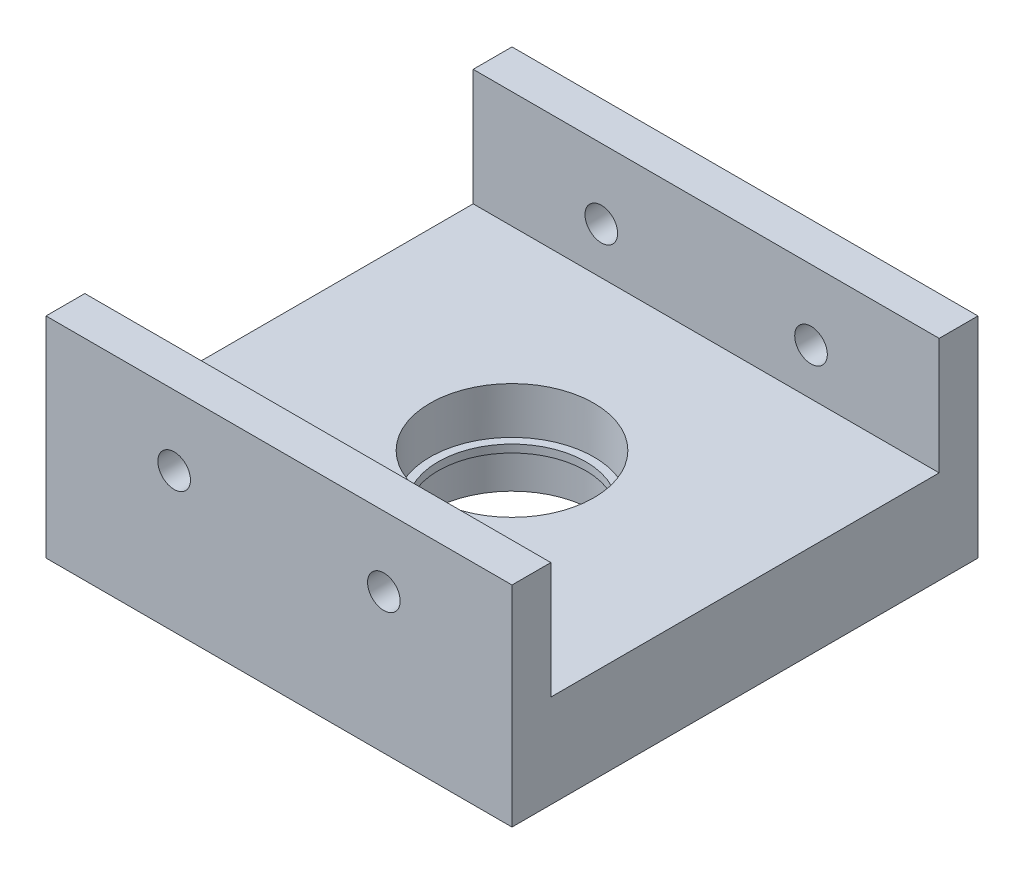
ISO-10303-21;
HEADER;
FILE_DESCRIPTION(('STEP AP214'),'2;1');
FILE_NAME('part.step','',(''),(''),'','','');
FILE_SCHEMA(('AUTOMOTIVE_DESIGN { 1 0 10303 214 1 1 1 1 }'));
ENDSEC;
DATA;
#1=APPLICATION_CONTEXT('core data for automotive mechanical design processes');
#2=APPLICATION_PROTOCOL_DEFINITION('international standard','automotive_design',2000,#1);
#3=PRODUCT_CONTEXT('',#1,'mechanical');
#4=PRODUCT('Part','Part','',(#3));
#5=PRODUCT_RELATED_PRODUCT_CATEGORY('part','',(#4));
#6=PRODUCT_DEFINITION_FORMATION('','',#4);
#7=PRODUCT_DEFINITION_CONTEXT('part definition',#1,'design');
#8=PRODUCT_DEFINITION('design','',#6,#7);
#9=PRODUCT_DEFINITION_SHAPE('','',#8);
#10=(LENGTH_UNIT() NAMED_UNIT(*) SI_UNIT(.MILLI.,.METRE.));
#11=(NAMED_UNIT(*) PLANE_ANGLE_UNIT() SI_UNIT($,.RADIAN.));
#12=(NAMED_UNIT(*) SI_UNIT($,.STERADIAN.) SOLID_ANGLE_UNIT());
#13=UNCERTAINTY_MEASURE_WITH_UNIT(LENGTH_MEASURE(1.E-05),#10,'distance_accuracy_value','');
#14=(GEOMETRIC_REPRESENTATION_CONTEXT(3) GLOBAL_UNCERTAINTY_ASSIGNED_CONTEXT((#13)) GLOBAL_UNIT_ASSIGNED_CONTEXT((#10,
#11,#12)) REPRESENTATION_CONTEXT('',''));
#15=CARTESIAN_POINT('',(0.,0.,0.));
#16=DIRECTION('',(0.,0.,1.));
#17=DIRECTION('',(1.,0.,0.));
#18=AXIS2_PLACEMENT_3D('',#15,#16,#17);
#19=CARTESIAN_POINT('',(0.,12.,0.));
#20=DIRECTION('',(0.,-1.,0.));
#21=DIRECTION('',(0.,0.,-1.));
#22=AXIS2_PLACEMENT_3D('',#19,#20,#21);
#23=CYLINDRICAL_SURFACE('',#22,9.5);
#24=CARTESIAN_POINT('',(0.,5.,0.));
#25=DIRECTION('',(0.,-1.,0.));
#26=DIRECTION('',(0.,0.,-1.));
#27=AXIS2_PLACEMENT_3D('',#24,#25,#26);
#28=CIRCLE('',#27,9.5);
#29=CARTESIAN_POINT('',(0.,5.,-9.5));
#30=VERTEX_POINT('',#29);
#31=EDGE_CURVE('E187',#30,#30,#28,.T.);
#32=ORIENTED_EDGE('',*,*,#31,.T.);
#33=EDGE_LOOP('',(#32));
#34=FACE_BOUND('',#33,.T.);
#35=CARTESIAN_POINT('',(0.,6.,0.));
#36=DIRECTION('',(0.,1.,0.));
#37=DIRECTION('',(0.,0.,1.));
#38=AXIS2_PLACEMENT_3D('',#35,#36,#37);
#39=CIRCLE('',#38,9.5);
#40=CARTESIAN_POINT('',(0.,6.,9.5));
#41=VERTEX_POINT('',#40);
#42=EDGE_CURVE('E44',#41,#41,#39,.T.);
#43=ORIENTED_EDGE('',*,*,#42,.T.);
#44=EDGE_LOOP('',(#43));
#45=FACE_BOUND('',#44,.T.);
#46=ADVANCED_FACE('F40',(#34,#45),#23,.F.);
#47=CARTESIAN_POINT('',(0.,12.,0.));
#48=DIRECTION('',(0.,-1.,0.));
#49=DIRECTION('',(0.,0.,-1.));
#50=AXIS2_PLACEMENT_3D('',#47,#48,#49);
#51=PLANE('',#50);
#52=CARTESIAN_POINT('',(0.,12.,0.));
#53=DIRECTION('',(0.,-1.,0.));
#54=DIRECTION('',(0.,0.,-1.));
#55=AXIS2_PLACEMENT_3D('',#52,#53,#54);
#56=CIRCLE('',#55,10.55);
#57=CARTESIAN_POINT('',(0.,12.,-10.55));
#58=VERTEX_POINT('',#57);
#59=EDGE_CURVE('E178',#58,#58,#56,.T.);
#60=ORIENTED_EDGE('',*,*,#59,.T.);
#61=EDGE_LOOP('',(#60));
#62=FACE_BOUND('',#61,.T.);
#63=DIRECTION('',(-1.,0.,0.));
#64=VECTOR('',#63,1.);
#65=CARTESIAN_POINT('',(30.,12.,25.));
#66=LINE('',#65,#64);
#67=CARTESIAN_POINT('',(30.,12.,25.));
#68=VERTEX_POINT('',#67);
#69=CARTESIAN_POINT('',(-30.,12.,25.));
#70=VERTEX_POINT('',#69);
#71=EDGE_CURVE('E58',#68,#70,#66,.T.);
#72=ORIENTED_EDGE('',*,*,#71,.F.);
#73=DIRECTION('',(0.,0.,-1.));
#74=VECTOR('',#73,1.);
#75=CARTESIAN_POINT('',(30.,12.,30.));
#76=LINE('',#75,#74);
#77=CARTESIAN_POINT('',(30.,12.,-25.));
#78=VERTEX_POINT('',#77);
#79=EDGE_CURVE('E191',#68,#78,#76,.T.);
#80=ORIENTED_EDGE('',*,*,#79,.T.);
#81=DIRECTION('',(1.,0.,0.));
#82=VECTOR('',#81,1.);
#83=CARTESIAN_POINT('',(30.,12.,-25.));
#84=LINE('',#83,#82);
#85=CARTESIAN_POINT('',(-30.,12.,-25.));
#86=VERTEX_POINT('',#85);
#87=EDGE_CURVE('E152',#86,#78,#84,.T.);
#88=ORIENTED_EDGE('',*,*,#87,.F.);
#89=DIRECTION('',(0.,0.,1.));
#90=VECTOR('',#89,1.);
#91=CARTESIAN_POINT('',(-30.,12.,30.));
#92=LINE('',#91,#90);
#93=EDGE_CURVE('E63',#86,#70,#92,.T.);
#94=ORIENTED_EDGE('',*,*,#93,.T.);
#95=EDGE_LOOP('',(#72,#80,#88,#94));
#96=FACE_BOUND('',#95,.T.);
#97=ADVANCED_FACE('F268',(#62,#96),#51,.F.);
#98=CARTESIAN_POINT('',(0.,0.,0.));
#99=DIRECTION('',(0.,-1.,0.));
#100=DIRECTION('',(0.,0.,-1.));
#101=AXIS2_PLACEMENT_3D('',#98,#99,#100);
#102=PLANE('',#101);
#103=CARTESIAN_POINT('',(0.,0.,0.));
#104=DIRECTION('',(0.,-1.,0.));
#105=DIRECTION('',(0.,0.,-1.));
#106=AXIS2_PLACEMENT_3D('',#103,#104,#105);
#107=CIRCLE('',#106,10.55);
#108=CARTESIAN_POINT('',(0.,0.,-10.55));
#109=VERTEX_POINT('',#108);
#110=EDGE_CURVE('E182',#109,#109,#107,.T.);
#111=ORIENTED_EDGE('',*,*,#110,.F.);
#112=EDGE_LOOP('',(#111));
#113=FACE_BOUND('',#112,.T.);
#114=DIRECTION('',(0.,0.,-1.));
#115=VECTOR('',#114,1.);
#116=CARTESIAN_POINT('',(30.,0.,30.));
#117=LINE('',#116,#115);
#118=CARTESIAN_POINT('',(30.,0.,30.));
#119=VERTEX_POINT('',#118);
#120=CARTESIAN_POINT('',(30.,0.,-30.));
#121=VERTEX_POINT('',#120);
#122=EDGE_CURVE('E196',#119,#121,#117,.T.);
#123=ORIENTED_EDGE('',*,*,#122,.F.);
#124=DIRECTION('',(1.,0.,0.));
#125=VECTOR('',#124,1.);
#126=CARTESIAN_POINT('',(-30.,0.,30.));
#127=LINE('',#126,#125);
#128=CARTESIAN_POINT('',(-30.,0.,30.));
#129=VERTEX_POINT('',#128);
#130=EDGE_CURVE('E113',#129,#119,#127,.T.);
#131=ORIENTED_EDGE('',*,*,#130,.F.);
#132=DIRECTION('',(0.,0.,1.));
#133=VECTOR('',#132,1.);
#134=CARTESIAN_POINT('',(-30.,0.,30.));
#135=LINE('',#134,#133);
#136=CARTESIAN_POINT('',(-30.,0.,-30.));
#137=VERTEX_POINT('',#136);
#138=EDGE_CURVE('E202',#137,#129,#135,.T.);
#139=ORIENTED_EDGE('',*,*,#138,.F.);
#140=DIRECTION('',(-1.,0.,0.));
#141=VECTOR('',#140,1.);
#142=CARTESIAN_POINT('',(-30.,0.,-30.));
#143=LINE('',#142,#141);
#144=EDGE_CURVE('E199',#121,#137,#143,.T.);
#145=ORIENTED_EDGE('',*,*,#144,.F.);
#146=EDGE_LOOP('',(#123,#131,#139,#145));
#147=FACE_BOUND('',#146,.T.);
#148=ADVANCED_FACE('F274',(#113,#147),#102,.T.);
#149=CARTESIAN_POINT('',(30.,12.,30.));
#150=DIRECTION('',(-1.,0.,0.));
#151=DIRECTION('',(0.,0.,1.));
#152=AXIS2_PLACEMENT_3D('',#149,#150,#151);
#153=PLANE('',#152);
#154=ORIENTED_EDGE('',*,*,#122,.T.);
#155=DIRECTION('',(0.,-1.,0.));
#156=VECTOR('',#155,1.);
#157=CARTESIAN_POINT('',(30.,12.,-30.));
#158=LINE('',#157,#156);
#159=CARTESIAN_POINT('',(30.,27.,-30.));
#160=VERTEX_POINT('',#159);
#161=EDGE_CURVE('E11',#160,#121,#158,.T.);
#162=ORIENTED_EDGE('',*,*,#161,.F.);
#163=DIRECTION('',(0.,0.,-1.));
#164=VECTOR('',#163,1.);
#165=CARTESIAN_POINT('',(30.,27.,-30.));
#166=LINE('',#165,#164);
#167=CARTESIAN_POINT('',(30.,27.,-25.));
#168=VERTEX_POINT('',#167);
#169=EDGE_CURVE('E153',#168,#160,#166,.T.);
#170=ORIENTED_EDGE('',*,*,#169,.F.);
#171=DIRECTION('',(0.,-1.,0.));
#172=VECTOR('',#171,1.);
#173=CARTESIAN_POINT('',(30.,27.,-25.));
#174=LINE('',#173,#172);
#175=EDGE_CURVE('E167',#168,#78,#174,.T.);
#176=ORIENTED_EDGE('',*,*,#175,.T.);
#177=ORIENTED_EDGE('',*,*,#79,.F.);
#178=DIRECTION('',(0.,-1.,0.));
#179=VECTOR('',#178,1.);
#180=CARTESIAN_POINT('',(30.,27.,25.));
#181=LINE('',#180,#179);
#182=CARTESIAN_POINT('',(30.,27.,25.));
#183=VERTEX_POINT('',#182);
#184=EDGE_CURVE('E123',#183,#68,#181,.T.);
#185=ORIENTED_EDGE('',*,*,#184,.F.);
#186=DIRECTION('',(0.,0.,-1.));
#187=VECTOR('',#186,1.);
#188=CARTESIAN_POINT('',(30.,27.,30.));
#189=LINE('',#188,#187);
#190=CARTESIAN_POINT('',(30.,27.,30.));
#191=VERTEX_POINT('',#190);
#192=EDGE_CURVE('E121',#191,#183,#189,.T.);
#193=ORIENTED_EDGE('',*,*,#192,.F.);
#194=DIRECTION('',(0.,-1.,0.));
#195=VECTOR('',#194,1.);
#196=CARTESIAN_POINT('',(30.,12.,30.));
#197=LINE('',#196,#195);
#198=EDGE_CURVE('E106',#191,#119,#197,.T.);
#199=ORIENTED_EDGE('',*,*,#198,.T.);
#200=EDGE_LOOP('',(#154,#162,#170,#176,#177,#185,#193,#199));
#201=FACE_BOUND('',#200,.T.);
#202=ADVANCED_FACE('F42',(#201),#153,.F.);
#203=CARTESIAN_POINT('',(-30.,12.,-30.));
#204=DIRECTION('',(0.,0.,1.));
#205=DIRECTION('',(1.,0.,0.));
#206=AXIS2_PLACEMENT_3D('',#203,#204,#205);
#207=PLANE('',#206);
#208=CARTESIAN_POINT('',(13.5,18.,-30.));
#209=DIRECTION('',(0.,0.,1.));
#210=DIRECTION('',(-1.,0.,0.));
#211=AXIS2_PLACEMENT_3D('',#208,#209,#210);
#212=CIRCLE('',#211,2.1);
#213=CARTESIAN_POINT('',(11.4,18.,-30.));
#214=VERTEX_POINT('',#213);
#215=EDGE_CURVE('E222',#214,#214,#212,.T.);
#216=ORIENTED_EDGE('',*,*,#215,.T.);
#217=EDGE_LOOP('',(#216));
#218=FACE_BOUND('',#217,.T.);
#219=CARTESIAN_POINT('',(-13.5,18.,-30.));
#220=DIRECTION('',(0.,0.,1.));
#221=DIRECTION('',(1.,0.,0.));
#222=AXIS2_PLACEMENT_3D('',#219,#220,#221);
#223=CIRCLE('',#222,2.1);
#224=CARTESIAN_POINT('',(-11.4,18.,-30.));
#225=VERTEX_POINT('',#224);
#226=EDGE_CURVE('E217',#225,#225,#223,.T.);
#227=ORIENTED_EDGE('',*,*,#226,.T.);
#228=EDGE_LOOP('',(#227));
#229=FACE_BOUND('',#228,.T.);
#230=ORIENTED_EDGE('',*,*,#144,.T.);
#231=DIRECTION('',(0.,-1.,0.));
#232=VECTOR('',#231,1.);
#233=CARTESIAN_POINT('',(-30.,12.,-30.));
#234=LINE('',#233,#232);
#235=CARTESIAN_POINT('',(-30.,27.,-30.));
#236=VERTEX_POINT('',#235);
#237=EDGE_CURVE('E50',#236,#137,#234,.T.);
#238=ORIENTED_EDGE('',*,*,#237,.F.);
#239=DIRECTION('',(-1.,0.,0.));
#240=VECTOR('',#239,1.);
#241=CARTESIAN_POINT('',(30.,27.,-30.));
#242=LINE('',#241,#240);
#243=EDGE_CURVE('E157',#160,#236,#242,.T.);
#244=ORIENTED_EDGE('',*,*,#243,.F.);
#245=ORIENTED_EDGE('',*,*,#161,.T.);
#246=EDGE_LOOP('',(#230,#238,#244,#245));
#247=FACE_BOUND('',#246,.T.);
#248=ADVANCED_FACE('F262',(#218,#229,#247),#207,.F.);
#249=CARTESIAN_POINT('',(-30.,12.,30.));
#250=DIRECTION('',(1.,0.,0.));
#251=DIRECTION('',(0.,0.,-1.));
#252=AXIS2_PLACEMENT_3D('',#249,#250,#251);
#253=PLANE('',#252);
#254=ORIENTED_EDGE('',*,*,#138,.T.);
#255=DIRECTION('',(0.,-1.,0.));
#256=VECTOR('',#255,1.);
#257=CARTESIAN_POINT('',(-30.,12.,30.));
#258=LINE('',#257,#256);
#259=CARTESIAN_POINT('',(-30.,27.,30.));
#260=VERTEX_POINT('',#259);
#261=EDGE_CURVE('E118',#260,#129,#258,.T.);
#262=ORIENTED_EDGE('',*,*,#261,.F.);
#263=DIRECTION('',(0.,0.,1.));
#264=VECTOR('',#263,1.);
#265=CARTESIAN_POINT('',(-30.,27.,30.));
#266=LINE('',#265,#264);
#267=CARTESIAN_POINT('',(-30.,27.,25.));
#268=VERTEX_POINT('',#267);
#269=EDGE_CURVE('E132',#268,#260,#266,.T.);
#270=ORIENTED_EDGE('',*,*,#269,.F.);
#271=DIRECTION('',(0.,-1.,0.));
#272=VECTOR('',#271,1.);
#273=CARTESIAN_POINT('',(-30.,27.,25.));
#274=LINE('',#273,#272);
#275=EDGE_CURVE('E145',#268,#70,#274,.T.);
#276=ORIENTED_EDGE('',*,*,#275,.T.);
#277=ORIENTED_EDGE('',*,*,#93,.F.);
#278=DIRECTION('',(0.,-1.,0.));
#279=VECTOR('',#278,1.);
#280=CARTESIAN_POINT('',(-30.,27.,-25.));
#281=LINE('',#280,#279);
#282=CARTESIAN_POINT('',(-30.,27.,-25.));
#283=VERTEX_POINT('',#282);
#284=EDGE_CURVE('E174',#283,#86,#281,.T.);
#285=ORIENTED_EDGE('',*,*,#284,.F.);
#286=DIRECTION('',(0.,0.,1.));
#287=VECTOR('',#286,1.);
#288=CARTESIAN_POINT('',(-30.,27.,-30.));
#289=LINE('',#288,#287);
#290=EDGE_CURVE('E161',#236,#283,#289,.T.);
#291=ORIENTED_EDGE('',*,*,#290,.F.);
#292=ORIENTED_EDGE('',*,*,#237,.T.);
#293=EDGE_LOOP('',(#254,#262,#270,#276,#277,#285,#291,#292));
#294=FACE_BOUND('',#293,.T.);
#295=ADVANCED_FACE('F252',(#294),#253,.F.);
#296=CARTESIAN_POINT('',(-30.,12.,30.));
#297=DIRECTION('',(0.,0.,-1.));
#298=DIRECTION('',(-1.,0.,0.));
#299=AXIS2_PLACEMENT_3D('',#296,#297,#298);
#300=PLANE('',#299);
#301=CARTESIAN_POINT('',(13.5,18.,30.));
#302=DIRECTION('',(0.,0.,1.));
#303=DIRECTION('',(-1.,0.,0.));
#304=AXIS2_PLACEMENT_3D('',#301,#302,#303);
#305=CIRCLE('',#304,2.1);
#306=CARTESIAN_POINT('',(11.4,18.,30.));
#307=VERTEX_POINT('',#306);
#308=EDGE_CURVE('E231',#307,#307,#305,.T.);
#309=ORIENTED_EDGE('',*,*,#308,.F.);
#310=EDGE_LOOP('',(#309));
#311=FACE_BOUND('',#310,.T.);
#312=CARTESIAN_POINT('',(-13.5,18.,30.));
#313=DIRECTION('',(0.,0.,1.));
#314=DIRECTION('',(1.,0.,0.));
#315=AXIS2_PLACEMENT_3D('',#312,#313,#314);
#316=CIRCLE('',#315,2.1);
#317=CARTESIAN_POINT('',(-11.4,18.,30.));
#318=VERTEX_POINT('',#317);
#319=EDGE_CURVE('E227',#318,#318,#316,.T.);
#320=ORIENTED_EDGE('',*,*,#319,.F.);
#321=EDGE_LOOP('',(#320));
#322=FACE_BOUND('',#321,.T.);
#323=ORIENTED_EDGE('',*,*,#130,.T.);
#324=ORIENTED_EDGE('',*,*,#198,.F.);
#325=DIRECTION('',(1.,0.,0.));
#326=VECTOR('',#325,1.);
#327=CARTESIAN_POINT('',(30.,27.,30.));
#328=LINE('',#327,#326);
#329=EDGE_CURVE('E111',#260,#191,#328,.T.);
#330=ORIENTED_EDGE('',*,*,#329,.F.);
#331=ORIENTED_EDGE('',*,*,#261,.T.);
#332=EDGE_LOOP('',(#323,#324,#330,#331));
#333=FACE_BOUND('',#332,.T.);
#334=ADVANCED_FACE('F108',(#311,#322,#333),#300,.F.);
#335=CARTESIAN_POINT('',(0.,5.,0.));
#336=DIRECTION('',(0.,-1.,0.));
#337=DIRECTION('',(0.,0.,-1.));
#338=AXIS2_PLACEMENT_3D('',#335,#336,#337);
#339=CYLINDRICAL_SURFACE('',#338,10.55);
#340=CARTESIAN_POINT('',(0.,5.,0.));
#341=DIRECTION('',(0.,-1.,0.));
#342=DIRECTION('',(0.,0.,-1.));
#343=AXIS2_PLACEMENT_3D('',#340,#341,#342);
#344=CIRCLE('',#343,10.55);
#345=CARTESIAN_POINT('',(0.,5.,-10.55));
#346=VERTEX_POINT('',#345);
#347=EDGE_CURVE('E183',#346,#346,#344,.T.);
#348=ORIENTED_EDGE('',*,*,#347,.F.);
#349=EDGE_LOOP('',(#348));
#350=FACE_BOUND('',#349,.T.);
#351=ORIENTED_EDGE('',*,*,#110,.T.);
#352=EDGE_LOOP('',(#351));
#353=FACE_BOUND('',#352,.T.);
#354=ADVANCED_FACE('F251',(#350,#353),#339,.F.);
#355=CARTESIAN_POINT('',(0.,5.,0.));
#356=DIRECTION('',(0.,-1.,0.));
#357=DIRECTION('',(0.,0.,-1.));
#358=AXIS2_PLACEMENT_3D('',#355,#356,#357);
#359=PLANE('',#358);
#360=ORIENTED_EDGE('',*,*,#31,.F.);
#361=EDGE_LOOP('',(#360));
#362=FACE_BOUND('',#361,.T.);
#363=ORIENTED_EDGE('',*,*,#347,.T.);
#364=EDGE_LOOP('',(#363));
#365=FACE_BOUND('',#364,.T.);
#366=ADVANCED_FACE('F259',(#362,#365),#359,.T.);
#367=CARTESIAN_POINT('',(0.,7.,0.));
#368=DIRECTION('',(0.,1.,0.));
#369=DIRECTION('',(0.,0.,1.));
#370=AXIS2_PLACEMENT_3D('',#367,#368,#369);
#371=CYLINDRICAL_SURFACE('',#370,10.55);
#372=ORIENTED_EDGE('',*,*,#59,.F.);
#373=EDGE_LOOP('',(#372));
#374=FACE_BOUND('',#373,.T.);
#375=CARTESIAN_POINT('',(0.,6.,0.));
#376=DIRECTION('',(0.,1.,0.));
#377=DIRECTION('',(0.,0.,1.));
#378=AXIS2_PLACEMENT_3D('',#375,#376,#377);
#379=CIRCLE('',#378,10.55);
#380=CARTESIAN_POINT('',(0.,6.,10.55));
#381=VERTEX_POINT('',#380);
#382=EDGE_CURVE('E239',#381,#381,#379,.T.);
#383=ORIENTED_EDGE('',*,*,#382,.F.);
#384=EDGE_LOOP('',(#383));
#385=FACE_BOUND('',#384,.T.);
#386=ADVANCED_FACE('F314',(#374,#385),#371,.F.);
#387=CARTESIAN_POINT('',(30.,27.,-25.));
#388=DIRECTION('',(0.,0.,-1.));
#389=DIRECTION('',(-1.,0.,0.));
#390=AXIS2_PLACEMENT_3D('',#387,#388,#389);
#391=PLANE('',#390);
#392=CARTESIAN_POINT('',(13.5,18.,-25.));
#393=DIRECTION('',(0.,0.,-1.));
#394=DIRECTION('',(-1.,0.,0.));
#395=AXIS2_PLACEMENT_3D('',#392,#393,#394);
#396=CIRCLE('',#395,2.1);
#397=CARTESIAN_POINT('',(11.4,18.,-25.));
#398=VERTEX_POINT('',#397);
#399=EDGE_CURVE('E221',#398,#398,#396,.T.);
#400=ORIENTED_EDGE('',*,*,#399,.T.);
#401=EDGE_LOOP('',(#400));
#402=FACE_BOUND('',#401,.T.);
#403=CARTESIAN_POINT('',(-13.5,18.,-25.));
#404=DIRECTION('',(0.,0.,-1.));
#405=DIRECTION('',(-1.,0.,0.));
#406=AXIS2_PLACEMENT_3D('',#403,#404,#405);
#407=CIRCLE('',#406,2.1);
#408=CARTESIAN_POINT('',(-15.6,18.,-25.));
#409=VERTEX_POINT('',#408);
#410=EDGE_CURVE('E137',#409,#409,#407,.T.);
#411=ORIENTED_EDGE('',*,*,#410,.T.);
#412=EDGE_LOOP('',(#411));
#413=FACE_BOUND('',#412,.T.);
#414=ORIENTED_EDGE('',*,*,#87,.T.);
#415=ORIENTED_EDGE('',*,*,#175,.F.);
#416=DIRECTION('',(1.,0.,0.));
#417=VECTOR('',#416,1.);
#418=CARTESIAN_POINT('',(30.,27.,-25.));
#419=LINE('',#418,#417);
#420=EDGE_CURVE('E164',#283,#168,#419,.T.);
#421=ORIENTED_EDGE('',*,*,#420,.F.);
#422=ORIENTED_EDGE('',*,*,#284,.T.);
#423=EDGE_LOOP('',(#414,#415,#421,#422));
#424=FACE_BOUND('',#423,.T.);
#425=ADVANCED_FACE('F297',(#402,#413,#424),#391,.F.);
#426=CARTESIAN_POINT('',(0.,27.,0.));
#427=DIRECTION('',(0.,-1.,0.));
#428=DIRECTION('',(0.,0.,-1.));
#429=AXIS2_PLACEMENT_3D('',#426,#427,#428);
#430=PLANE('',#429);
#431=ORIENTED_EDGE('',*,*,#169,.T.);
#432=ORIENTED_EDGE('',*,*,#243,.T.);
#433=ORIENTED_EDGE('',*,*,#290,.T.);
#434=ORIENTED_EDGE('',*,*,#420,.T.);
#435=EDGE_LOOP('',(#431,#432,#433,#434));
#436=FACE_BOUND('',#435,.T.);
#437=ADVANCED_FACE('F292',(#436),#430,.F.);
#438=CARTESIAN_POINT('',(30.,27.,25.));
#439=DIRECTION('',(0.,0.,1.));
#440=DIRECTION('',(1.,0.,0.));
#441=AXIS2_PLACEMENT_3D('',#438,#439,#440);
#442=PLANE('',#441);
#443=CARTESIAN_POINT('',(13.5,18.,25.));
#444=DIRECTION('',(0.,0.,1.));
#445=DIRECTION('',(1.,0.,0.));
#446=AXIS2_PLACEMENT_3D('',#443,#444,#445);
#447=CIRCLE('',#446,2.1);
#448=CARTESIAN_POINT('',(15.6,18.,25.));
#449=VERTEX_POINT('',#448);
#450=EDGE_CURVE('E218',#449,#449,#447,.T.);
#451=ORIENTED_EDGE('',*,*,#450,.T.);
#452=EDGE_LOOP('',(#451));
#453=FACE_BOUND('',#452,.T.);
#454=CARTESIAN_POINT('',(-13.5,18.,25.));
#455=DIRECTION('',(0.,0.,1.));
#456=DIRECTION('',(1.,0.,0.));
#457=AXIS2_PLACEMENT_3D('',#454,#455,#456);
#458=CIRCLE('',#457,2.1);
#459=CARTESIAN_POINT('',(-11.4,18.,25.));
#460=VERTEX_POINT('',#459);
#461=EDGE_CURVE('E214',#460,#460,#458,.T.);
#462=ORIENTED_EDGE('',*,*,#461,.T.);
#463=EDGE_LOOP('',(#462));
#464=FACE_BOUND('',#463,.T.);
#465=ORIENTED_EDGE('',*,*,#71,.T.);
#466=ORIENTED_EDGE('',*,*,#275,.F.);
#467=DIRECTION('',(-1.,0.,0.));
#468=VECTOR('',#467,1.);
#469=CARTESIAN_POINT('',(30.,27.,25.));
#470=LINE('',#469,#468);
#471=EDGE_CURVE('E127',#183,#268,#470,.T.);
#472=ORIENTED_EDGE('',*,*,#471,.F.);
#473=ORIENTED_EDGE('',*,*,#184,.T.);
#474=EDGE_LOOP('',(#465,#466,#472,#473));
#475=FACE_BOUND('',#474,.T.);
#476=ADVANCED_FACE('F299',(#453,#464,#475),#442,.F.);
#477=CARTESIAN_POINT('',(0.,27.,0.));
#478=DIRECTION('',(0.,-1.,0.));
#479=DIRECTION('',(0.,0.,-1.));
#480=AXIS2_PLACEMENT_3D('',#477,#478,#479);
#481=PLANE('',#480);
#482=ORIENTED_EDGE('',*,*,#329,.T.);
#483=ORIENTED_EDGE('',*,*,#192,.T.);
#484=ORIENTED_EDGE('',*,*,#471,.T.);
#485=ORIENTED_EDGE('',*,*,#269,.T.);
#486=EDGE_LOOP('',(#482,#483,#484,#485));
#487=FACE_BOUND('',#486,.T.);
#488=ADVANCED_FACE('F130',(#487),#481,.F.);
#489=CARTESIAN_POINT('',(-13.5,18.,-30.));
#490=DIRECTION('',(0.,0.,1.));
#491=DIRECTION('',(1.,0.,0.));
#492=AXIS2_PLACEMENT_3D('',#489,#490,#491);
#493=CYLINDRICAL_SURFACE('',#492,2.1);
#494=ORIENTED_EDGE('',*,*,#319,.T.);
#495=EDGE_LOOP('',(#494));
#496=FACE_BOUND('',#495,.T.);
#497=ORIENTED_EDGE('',*,*,#461,.F.);
#498=EDGE_LOOP('',(#497));
#499=FACE_BOUND('',#498,.T.);
#500=ADVANCED_FACE('F247',(#496,#499),#493,.F.);
#501=ORIENTED_EDGE('',*,*,#226,.F.);
#502=EDGE_LOOP('',(#501));
#503=FACE_BOUND('',#502,.T.);
#504=ORIENTED_EDGE('',*,*,#410,.F.);
#505=EDGE_LOOP('',(#504));
#506=FACE_BOUND('',#505,.T.);
#507=ADVANCED_FACE('F357',(#503,#506),#493,.F.);
#508=CARTESIAN_POINT('',(13.5,18.,-30.));
#509=DIRECTION('',(0.,0.,1.));
#510=DIRECTION('',(1.,0.,0.));
#511=AXIS2_PLACEMENT_3D('',#508,#509,#510);
#512=CYLINDRICAL_SURFACE('',#511,2.1);
#513=ORIENTED_EDGE('',*,*,#308,.T.);
#514=EDGE_LOOP('',(#513));
#515=FACE_BOUND('',#514,.T.);
#516=ORIENTED_EDGE('',*,*,#450,.F.);
#517=EDGE_LOOP('',(#516));
#518=FACE_BOUND('',#517,.T.);
#519=ADVANCED_FACE('F364',(#515,#518),#512,.F.);
#520=ORIENTED_EDGE('',*,*,#215,.F.);
#521=EDGE_LOOP('',(#520));
#522=FACE_BOUND('',#521,.T.);
#523=ORIENTED_EDGE('',*,*,#399,.F.);
#524=EDGE_LOOP('',(#523));
#525=FACE_BOUND('',#524,.T.);
#526=ADVANCED_FACE('F372',(#522,#525),#512,.F.);
#527=CARTESIAN_POINT('',(0.,6.,0.));
#528=DIRECTION('',(0.,1.,0.));
#529=DIRECTION('',(0.,0.,1.));
#530=AXIS2_PLACEMENT_3D('',#527,#528,#529);
#531=PLANE('',#530);
#532=ORIENTED_EDGE('',*,*,#42,.F.);
#533=EDGE_LOOP('',(#532));
#534=FACE_BOUND('',#533,.T.);
#535=ORIENTED_EDGE('',*,*,#382,.T.);
#536=EDGE_LOOP('',(#535));
#537=FACE_BOUND('',#536,.T.);
#538=ADVANCED_FACE('F381',(#534,#537),#531,.T.);
#539=CLOSED_SHELL('',(#46,#97,#148,#202,#248,#295,#334,#354,#366,#386,#425,#437,#476,#488,#500,
#507,#519,#526,#538));
#540=MANIFOLD_SOLID_BREP('B2',#539);
#541=ADVANCED_BREP_SHAPE_REPRESENTATION('',(#18,#540),#14);
#542=SHAPE_DEFINITION_REPRESENTATION(#9,#541);
ENDSEC;
END-ISO-10303-21;
